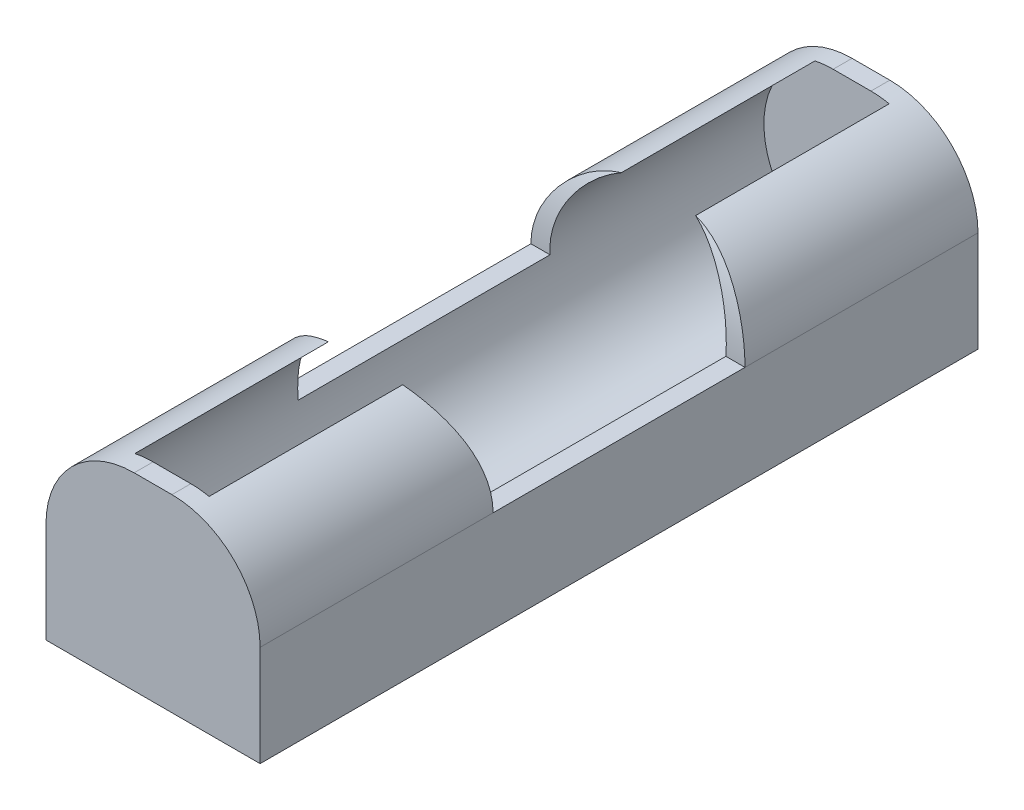
ISO-10303-21;
HEADER;
FILE_DESCRIPTION(('STEP AP214'),'2;1');
FILE_NAME('part.step','',(''),(''),'','','');
FILE_SCHEMA(('AUTOMOTIVE_DESIGN { 1 0 10303 214 1 1 1 1 }'));
ENDSEC;
DATA;
#1=APPLICATION_CONTEXT('core data for automotive mechanical design processes');
#2=APPLICATION_PROTOCOL_DEFINITION('international standard','automotive_design',2000,#1);
#3=PRODUCT_CONTEXT('',#1,'mechanical');
#4=PRODUCT('Part','Part','',(#3));
#5=PRODUCT_RELATED_PRODUCT_CATEGORY('part','',(#4));
#6=PRODUCT_DEFINITION_FORMATION('','',#4);
#7=PRODUCT_DEFINITION_CONTEXT('part definition',#1,'design');
#8=PRODUCT_DEFINITION('design','',#6,#7);
#9=PRODUCT_DEFINITION_SHAPE('','',#8);
#10=(LENGTH_UNIT() NAMED_UNIT(*) SI_UNIT(.MILLI.,.METRE.));
#11=(NAMED_UNIT(*) PLANE_ANGLE_UNIT() SI_UNIT($,.RADIAN.));
#12=(NAMED_UNIT(*) SI_UNIT($,.STERADIAN.) SOLID_ANGLE_UNIT());
#13=UNCERTAINTY_MEASURE_WITH_UNIT(LENGTH_MEASURE(1.E-05),#10,'distance_accuracy_value','');
#14=(GEOMETRIC_REPRESENTATION_CONTEXT(3) GLOBAL_UNCERTAINTY_ASSIGNED_CONTEXT((#13)) GLOBAL_UNIT_ASSIGNED_CONTEXT((#10,
#11,#12)) REPRESENTATION_CONTEXT('',''));
#15=CARTESIAN_POINT('',(0.,0.,0.));
#16=DIRECTION('',(0.,0.,1.));
#17=DIRECTION('',(1.,0.,0.));
#18=AXIS2_PLACEMENT_3D('',#15,#16,#17);
#19=CARTESIAN_POINT('',(7.,8.,0.));
#20=DIRECTION('',(0.,0.,-1.));
#21=DIRECTION('',(-1.,0.,0.));
#22=AXIS2_PLACEMENT_3D('',#19,#20,#21);
#23=CYLINDRICAL_SURFACE('',#22,7.);
#24=CARTESIAN_POINT('',(0.,8.,38.5));
#25=CARTESIAN_POINT('',(-3.02791428196093E-05,8.18650256948795,38.4999677908487));
#26=CARTESIAN_POINT('',(0.00745213054668745,8.37299027210222,38.5034324845597));
#27=CARTESIAN_POINT('',(0.037215864047471,8.74446608335291,38.5171193158626));
#28=CARTESIAN_POINT('',(0.0594918594259879,8.92945470766089,38.5273390203924));
#29=CARTESIAN_POINT('',(0.118493592438619,9.29583497064132,38.5542437349727));
#30=CARTESIAN_POINT('',(0.15515882014047,9.47723837333369,38.5709016664496));
#31=CARTESIAN_POINT('',(0.242536662112689,9.83596427761062,38.6102466221706));
#32=CARTESIAN_POINT('',(0.293250024713716,10.0132865612527,38.6329339675932));
#33=CARTESIAN_POINT('',(0.408146309980953,10.3624580147491,38.6837415865444));
#34=CARTESIAN_POINT('',(0.472312697479756,10.5343136078208,38.7118551873034));
#35=CARTESIAN_POINT('',(0.613590811963072,10.8718043932372,38.7728641703432));
#36=CARTESIAN_POINT('',(0.690707383931659,11.0374372290081,38.8057613416559));
#37=CARTESIAN_POINT('',(0.857288701106083,11.3615938306308,38.8755824875798));
#38=CARTESIAN_POINT('',(0.94675937813588,11.520114132662,38.9125083947905));
#39=CARTESIAN_POINT('',(1.13737812467051,11.8291865805172,38.9895356222528));
#40=CARTESIAN_POINT('',(1.23853045864626,11.9797357869996,39.0296381004452));
#41=CARTESIAN_POINT('',(1.56979552598819,12.4337226634995,39.1577374007052));
#42=CARTESIAN_POINT('',(1.81897872042694,12.7224274844587,39.2497252584945));
#43=CARTESIAN_POINT('',(2.36070650062446,13.2556193063271,39.4350476163557));
#44=CARTESIAN_POINT('',(2.65327851553056,13.5000781175407,39.5283829343146));
#45=CARTESIAN_POINT('',(3.12996211168698,13.8364322657891,39.6650386165154));
#46=CARTESIAN_POINT('',(3.30083644091571,13.9462234576248,39.7113421661203));
#47=CARTESIAN_POINT('',(3.65219577203618,14.1508937626844,39.8001547649785));
#48=CARTESIAN_POINT('',(3.83267670643964,14.2457791209261,39.8426654000864));
#49=CARTESIAN_POINT('',(4.20193543223279,14.4196915654634,39.9224013398545));
#50=CARTESIAN_POINT('',(4.39070178599675,14.4987397239425,39.9596336480315));
#51=CARTESIAN_POINT('',(4.7754678314699,14.6402893059798,40.0275029979085));
#52=CARTESIAN_POINT('',(4.97146548802733,14.7027953452233,40.0581418789009));
#53=CARTESIAN_POINT('',(5.31823632549567,14.7967031406384,40.1047627410677));
#54=CARTESIAN_POINT('',(5.46774085884352,14.8319711777166,40.1224889162482));
#55=CARTESIAN_POINT('',(5.76919289199374,14.8926586863574,40.1532079750568));
#56=CARTESIAN_POINT('',(5.92113981342177,14.9180804548168,40.1662019625477));
#57=CARTESIAN_POINT('',(6.22710310970781,14.9589147458429,40.1871585675717));
#58=CARTESIAN_POINT('',(6.38112367665987,14.9743023323637,40.195108649128));
#59=CARTESIAN_POINT('',(6.69009258185685,14.9948551518446,40.2057548105728));
#60=CARTESIAN_POINT('',(6.84504129783201,15.0000158926547,40.2084485816147));
#61=CARTESIAN_POINT('',(7.,15.,40.2084247660083));
#62=B_SPLINE_CURVE_WITH_KNOTS('',3,(#24,#25,#26,#27,#28,#29,#30,#31,#32,#33,#34,#35,#36,#37,#38,
#39,#40,#41,#42,#43,#44,#45,#46,#47,#48,#49,#50,#51,#52,#53,#54,#55,#56,#57,#58,#59,#60,#61),
.UNSPECIFIED.,.F.,.F.,(4,2,2,2,2,2,2,2,2,2,2,2,2,2,2,2,2,2,4),(0.,0.559302324050476,
1.11840330478182,1.67517790950467,2.23198217878145,2.78810604816921,3.34443844267088,
3.90103889512943,4.45784318464529,5.62945222995478,6.80180511474766,7.42608968451207,
8.05011199949043,8.67329842548846,9.29631078234666,9.75981829178785,10.2232176108998,
10.6877641834084,11.152514763168),.UNSPECIFIED.);
#63=CARTESIAN_POINT('',(0.,8.,38.5));
#64=VERTEX_POINT('',#63);
#65=CARTESIAN_POINT('',(5.55056825520774,14.8482952343768,40.1307610543573));
#66=VERTEX_POINT('',#65);
#67=EDGE_CURVE('E170',#64,#66,#62,.T.);
#68=ORIENTED_EDGE('',*,*,#67,.F.);
#69=DIRECTION('',(0.,0.,1.));
#70=VECTOR('',#69,1.);
#71=CARTESIAN_POINT('',(0.,8.,0.));
#72=LINE('',#71,#70);
#73=CARTESIAN_POINT('',(0.,8.,57.));
#74=VERTEX_POINT('',#73);
#75=EDGE_CURVE('E61',#74,#64,#72,.F.);
#76=ORIENTED_EDGE('',*,*,#75,.F.);
#77=CARTESIAN_POINT('',(7.,8.,57.));
#78=DIRECTION('',(0.,0.,1.));
#79=DIRECTION('',(1.,0.,0.));
#80=AXIS2_PLACEMENT_3D('',#77,#78,#79);
#81=CIRCLE('',#80,7.);
#82=CARTESIAN_POINT('',(7.,15.,57.));
#83=VERTEX_POINT('',#82);
#84=EDGE_CURVE('E225',#83,#74,#81,.T.);
#85=ORIENTED_EDGE('',*,*,#84,.F.);
#86=DIRECTION('',(0.,0.,-1.));
#87=VECTOR('',#86,1.);
#88=CARTESIAN_POINT('',(7.,15.,57.));
#89=LINE('',#88,#87);
#90=CARTESIAN_POINT('',(7.,15.,55.5));
#91=VERTEX_POINT('',#90);
#92=EDGE_CURVE('E220',#83,#91,#89,.T.);
#93=ORIENTED_EDGE('',*,*,#92,.T.);
#94=CARTESIAN_POINT('',(7.,8.,55.5));
#95=DIRECTION('',(0.,0.,1.));
#96=DIRECTION('',(1.,0.,0.));
#97=AXIS2_PLACEMENT_3D('',#94,#95,#96);
#98=CIRCLE('',#97,7.);
#99=CARTESIAN_POINT('',(5.55056825520773,14.8482952343768,55.5));
#100=VERTEX_POINT('',#99);
#101=EDGE_CURVE('E226',#91,#100,#98,.T.);
#102=ORIENTED_EDGE('',*,*,#101,.T.);
#103=DIRECTION('',(0.,0.,1.));
#104=VECTOR('',#103,1.);
#105=CARTESIAN_POINT('',(5.55056825520774,14.8482952343768,1.49999999999999));
#106=LINE('',#105,#104);
#107=EDGE_CURVE('E188',#66,#100,#106,.T.);
#108=ORIENTED_EDGE('',*,*,#107,.F.);
#109=EDGE_LOOP('',(#68,#76,#85,#93,#102,#108));
#110=FACE_BOUND('',#109,.T.);
#111=ADVANCED_FACE('F52',(#110),#23,.T.);
#112=CARTESIAN_POINT('',(10.,8.,0.));
#113=DIRECTION('',(0.,0.,-1.));
#114=DIRECTION('',(1.,0.,0.));
#115=AXIS2_PLACEMENT_3D('',#112,#113,#114);
#116=CYLINDRICAL_SURFACE('',#115,7.);
#117=CARTESIAN_POINT('',(10.,15.,40.2084247660083));
#118=CARTESIAN_POINT('',(10.1854412621884,15.0000324541237,40.2084731712669));
#119=CARTESIAN_POINT('',(10.3708608458787,14.9926325746591,40.2046015608605));
#120=CARTESIAN_POINT('',(10.7401355516913,14.9632152010779,40.1893771176512));
#121=CARTESIAN_POINT('',(10.9239914249849,14.9412051800731,40.1780281095717));
#122=CARTESIAN_POINT('',(11.2878881526745,14.8829616751622,40.1482823627289));
#123=CARTESIAN_POINT('',(11.4679435923076,14.8468006413974,40.1299215343523));
#124=CARTESIAN_POINT('',(11.8239430822851,14.7606782625787,40.086793100389));
#125=CARTESIAN_POINT('',(11.9998867578867,14.7107156649405,40.0620249133046));
#126=CARTESIAN_POINT('',(12.3462072988617,14.5976075424376,40.0069299512024));
#127=CARTESIAN_POINT('',(12.5165941399178,14.5344873380762,39.9766138660473));
#128=CARTESIAN_POINT('',(12.8512187639469,14.3955778071478,39.9113052016491));
#129=CARTESIAN_POINT('',(13.0154541915084,14.3197836871574,39.8763108540401));
#130=CARTESIAN_POINT('',(13.4979236506651,14.0741003564268,39.7657010943418));
#131=CARTESIAN_POINT('',(13.8058007499831,13.8859497641458,39.684479185882));
#132=CARTESIAN_POINT('',(14.4077967018608,13.4514865106073,39.5095269265994));
#133=CARTESIAN_POINT('',(14.699512182645,13.2020631937885,39.415320466167));
#134=CARTESIAN_POINT('',(15.2389090592956,12.6583517610123,39.2288326434394));
#135=CARTESIAN_POINT('',(15.4865785338824,12.3640515388002,39.1365518082716));
#136=CARTESIAN_POINT('',(15.8264703359022,11.8850449762373,39.0040493126311));
#137=CARTESIAN_POINT('',(15.9369219704537,11.7141004037034,38.9597987307507));
#138=CARTESIAN_POINT('',(16.1429037894526,11.3624672430159,38.8756079910039));
#139=CARTESIAN_POINT('',(16.238440267547,11.1817828082593,38.8356660172743));
#140=CARTESIAN_POINT('',(16.4136174197485,10.8120003278364,38.7612736386271));
#141=CARTESIAN_POINT('',(16.4932728074812,10.6229102704265,38.7268181565616));
#142=CARTESIAN_POINT('',(16.6359337743815,10.2375356499936,38.6643815020905));
#143=CARTESIAN_POINT('',(16.6989436346161,10.0412529516649,38.6363986652146));
#144=CARTESIAN_POINT('',(16.7939196227097,9.69308974986792,38.5938729073477));
#145=CARTESIAN_POINT('',(16.8297079870182,9.54243542957573,38.5777195719513));
#146=CARTESIAN_POINT('',(16.8912688752648,9.23871432324135,38.549807639827));
#147=CARTESIAN_POINT('',(16.9170435884872,9.08564807214298,38.538048082509));
#148=CARTESIAN_POINT('',(16.9584130943004,8.77760227803198,38.5191251927904));
#149=CARTESIAN_POINT('',(16.9739907729556,8.62261996103152,38.5119695876589));
#150=CARTESIAN_POINT('',(16.9947934314971,8.31176105991506,38.5023982883734));
#151=CARTESIAN_POINT('',(17.0000146632402,8.1558841725027,38.4999843102839));
#152=CARTESIAN_POINT('',(17.,8.,38.5));
#153=B_SPLINE_CURVE_WITH_KNOTS('',3,(#117,#118,#119,#120,#121,#122,#123,#124,#125,#126,#127,
#128,#129,#130,#131,#132,#133,#134,#135,#136,#137,#138,#139,#140,#141,#142,#143,#144,#145,#146,
#147,#148,#149,#150,#151,#152),.UNSPECIFIED.,.F.,.F.,(4,2,2,2,2,2,2,2,2,2,2,2,2,2,2,2,2,4),(0.,
0.556101628184102,1.11191902841882,1.6649272290295,2.21798563533433,2.76998940207518,
3.32220241728364,4.42700835160839,5.60781482746749,6.78894040993027,7.41310382432549,
8.03700314870989,8.66032172446644,9.28347983235444,9.75016624468459,10.2167505678759,
10.6841159768882,11.1516505011554),.UNSPECIFIED.);
#154=CARTESIAN_POINT('',(11.4494317447923,14.8482952343768,40.1307610543573));
#155=VERTEX_POINT('',#154);
#156=CARTESIAN_POINT('',(17.,8.,38.5));
#157=VERTEX_POINT('',#156);
#158=EDGE_CURVE('E299',#155,#157,#153,.T.);
#159=ORIENTED_EDGE('',*,*,#158,.F.);
#160=DIRECTION('',(0.,0.,1.));
#161=VECTOR('',#160,1.);
#162=CARTESIAN_POINT('',(11.4494317447923,14.8482952343768,1.49999999999999));
#163=LINE('',#162,#161);
#164=CARTESIAN_POINT('',(11.4494317447923,14.8482952343768,55.5));
#165=VERTEX_POINT('',#164);
#166=EDGE_CURVE('E246',#155,#165,#163,.T.);
#167=ORIENTED_EDGE('',*,*,#166,.T.);
#168=CARTESIAN_POINT('',(10.,8.,55.5));
#169=DIRECTION('',(0.,0.,-1.));
#170=DIRECTION('',(-1.,0.,0.));
#171=AXIS2_PLACEMENT_3D('',#168,#169,#170);
#172=CIRCLE('',#171,7.);
#173=CARTESIAN_POINT('',(10.,15.,55.5));
#174=VERTEX_POINT('',#173);
#175=EDGE_CURVE('E263',#174,#165,#172,.T.);
#176=ORIENTED_EDGE('',*,*,#175,.F.);
#177=DIRECTION('',(0.,0.,-1.));
#178=VECTOR('',#177,1.);
#179=CARTESIAN_POINT('',(10.,15.,57.));
#180=LINE('',#179,#178);
#181=CARTESIAN_POINT('',(10.,15.,57.));
#182=VERTEX_POINT('',#181);
#183=EDGE_CURVE('E259',#182,#174,#180,.T.);
#184=ORIENTED_EDGE('',*,*,#183,.F.);
#185=CARTESIAN_POINT('',(10.,8.,57.));
#186=DIRECTION('',(0.,0.,-1.));
#187=DIRECTION('',(-1.,0.,0.));
#188=AXIS2_PLACEMENT_3D('',#185,#186,#187);
#189=CIRCLE('',#188,7.);
#190=CARTESIAN_POINT('',(17.,8.,57.));
#191=VERTEX_POINT('',#190);
#192=EDGE_CURVE('E262',#182,#191,#189,.T.);
#193=ORIENTED_EDGE('',*,*,#192,.T.);
#194=DIRECTION('',(0.,0.,1.));
#195=VECTOR('',#194,1.);
#196=CARTESIAN_POINT('',(17.,8.,0.));
#197=LINE('',#196,#195);
#198=EDGE_CURVE('E239',#191,#157,#197,.F.);
#199=ORIENTED_EDGE('',*,*,#198,.T.);
#200=EDGE_LOOP('',(#159,#167,#176,#184,#193,#199));
#201=FACE_BOUND('',#200,.T.);
#202=ADVANCED_FACE('F398',(#201),#116,.T.);
#203=CARTESIAN_POINT('',(8.50000000000001,8.5,1.49999999999999));
#204=DIRECTION('',(0.,0.,1.));
#205=DIRECTION('',(1.,0.,0.));
#206=AXIS2_PLACEMENT_3D('',#203,#204,#205);
#207=CYLINDRICAL_SURFACE('',#206,7.);
#208=ORIENTED_EDGE('',*,*,#166,.F.);
#209=CARTESIAN_POINT('',(11.4494317447923,14.8482952343768,40.1307610543573));
#210=CARTESIAN_POINT('',(11.6337469610843,14.7626672839438,40.087531979772));
#211=CARTESIAN_POINT('',(11.8137173622224,14.6692888567686,40.0414001547837));
#212=CARTESIAN_POINT('',(12.1639841350562,14.467913532549,39.9448607290055));
#213=CARTESIAN_POINT('',(12.3342844272727,14.3599226207448,39.8944548819848));
#214=CARTESIAN_POINT('',(12.6644623694094,14.1300751905805,39.7908330767821));
#215=CARTESIAN_POINT('',(12.8243346859687,14.0082116632285,39.7376157054489));
#216=CARTESIAN_POINT('',(13.1327658226233,13.7514514578451,39.6298655904827));
#217=CARTESIAN_POINT('',(13.2813246332279,13.6165547688806,39.5753328457463));
#218=CARTESIAN_POINT('',(13.5662045345359,13.3346345735054,39.4664255371684));
#219=CARTESIAN_POINT('',(13.7025374840532,13.1876230897724,39.4120508706463));
#220=CARTESIAN_POINT('',(13.9623357712292,12.8821331610172,39.3047651579916));
#221=CARTESIAN_POINT('',(14.0858009910401,12.7236546109977,39.2518541252668));
#222=CARTESIAN_POINT('',(14.3190540620396,12.3960301869941,39.14878687506));
#223=CARTESIAN_POINT('',(14.4288392513335,12.2268822465475,39.0986311947796));
#224=CARTESIAN_POINT('',(14.6337933398323,11.8789530302579,39.0023413295827));
#225=CARTESIAN_POINT('',(14.7289684037652,11.7001758607127,38.9562054520874));
#226=CARTESIAN_POINT('',(14.9037598522091,11.3342401749208,38.8691401739945));
#227=CARTESIAN_POINT('',(14.9833962835988,11.147092845836,38.828204089112));
#228=CARTESIAN_POINT('',(15.1263672162089,10.7655541996653,38.7525273551394));
#229=CARTESIAN_POINT('',(15.1897097219185,10.5711664933959,38.7177836665837));
#230=CARTESIAN_POINT('',(15.2992831542113,10.1767757781105,38.6554042552277));
#231=CARTESIAN_POINT('',(15.3455357482627,9.97678022772734,38.6277595456422));
#232=CARTESIAN_POINT('',(15.4203708846891,9.57269316500941,38.5802381631633));
#233=CARTESIAN_POINT('',(15.4489623176001,9.36860376700731,38.5603575837042));
#234=CARTESIAN_POINT('',(15.4868665849487,8.97036198422387,38.5297832125745));
#235=CARTESIAN_POINT('',(15.4972308610992,8.77634595195152,38.518610790278));
#236=CARTESIAN_POINT('',(15.5018040937796,8.3880320007164,38.5037038316088));
#237=CARTESIAN_POINT('',(15.4960289396507,8.19373454709188,38.4999619860059));
#238=CARTESIAN_POINT('',(15.4821200218845,8.,38.5));
#239=B_SPLINE_CURVE_WITH_KNOTS('',3,(#209,#210,#211,#212,#213,#214,#215,#216,#217,#218,#219,
#220,#221,#222,#223,#224,#225,#226,#227,#228,#229,#230,#231,#232,#233,#234,#235,#236,#237,#238),
.UNSPECIFIED.,.F.,.F.,(4,2,2,2,2,2,2,2,2,2,2,2,2,2,4),(0.,0.623054256991748,1.2458540805673,
1.86896997551996,2.49208639319073,3.11459171215269,3.73710273176597,4.35973469261608,
4.98210320808351,5.603663398848,6.22491765876538,6.84538153568042,7.46553281924754,
8.0485667675919,8.63102691867463),.UNSPECIFIED.);
#240=CARTESIAN_POINT('',(15.4821200218845,8.,38.5));
#241=VERTEX_POINT('',#240);
#242=EDGE_CURVE('E189',#155,#241,#239,.T.);
#243=ORIENTED_EDGE('',*,*,#242,.T.);
#244=DIRECTION('',(0.,0.,1.));
#245=VECTOR('',#244,1.);
#246=CARTESIAN_POINT('',(15.4821200218845,8.,1.49999999999999));
#247=LINE('',#246,#245);
#248=CARTESIAN_POINT('',(15.4821200218845,8.,18.5));
#249=VERTEX_POINT('',#248);
#250=EDGE_CURVE('E351',#241,#249,#247,.F.);
#251=ORIENTED_EDGE('',*,*,#250,.T.);
#252=CARTESIAN_POINT('',(15.4821200218845,8.,18.5));
#253=CARTESIAN_POINT('',(15.4953924195734,8.18491476415777,18.5000321634661));
#254=CARTESIAN_POINT('',(15.5012589327622,8.37034981336692,18.4966257522864));
#255=CARTESIAN_POINT('',(15.4982998430816,8.74079943802541,18.4830538648903));
#256=CARTESIAN_POINT('',(15.4894787756302,8.92581412561468,18.4728904757615));
#257=CARTESIAN_POINT('',(15.4573409139331,9.293292469376,18.44598010936));
#258=CARTESIAN_POINT('',(15.4340861126515,9.47576364078782,18.4292613997336));
#259=CARTESIAN_POINT('',(15.3734518859583,9.8376525381275,18.3895668917266));
#260=CARTESIAN_POINT('',(15.3360719506767,10.0170701535879,18.3665908674862));
#261=CARTESIAN_POINT('',(15.2476663462478,10.3714477983496,18.3148722381981));
#262=CARTESIAN_POINT('',(15.1966551615051,10.5464123445409,18.2861357621892));
#263=CARTESIAN_POINT('',(15.0814784097516,10.891060908679,18.223459630963));
#264=CARTESIAN_POINT('',(15.0173078592263,11.0607428979732,18.1895180057625));
#265=CARTESIAN_POINT('',(14.8763593894366,11.3939197756699,18.1171009150364));
#266=CARTESIAN_POINT('',(14.7995734256362,11.5574106337501,18.0786225610011));
#267=CARTESIAN_POINT('',(14.6340397614469,11.8772815223083,17.9979197152784));
#268=CARTESIAN_POINT('',(14.5452875275035,12.0336588275606,17.9556938058704));
#269=CARTESIAN_POINT('',(14.2524206527622,12.5064263875502,17.8201894150438));
#270=CARTESIAN_POINT('',(14.0288098595856,12.8095860360227,17.7218528927908));
#271=CARTESIAN_POINT('',(13.5371449109676,13.3752166119242,17.5206679525847));
#272=CARTESIAN_POINT('',(13.2691045244221,13.6377000964372,17.4178209396887));
#273=CARTESIAN_POINT('',(12.7496344684754,14.0705991882188,17.2362426811158));
#274=CARTESIAN_POINT('',(12.5051071625103,14.2489929690072,17.1567103987009));
#275=CARTESIAN_POINT('',(11.9935059255263,14.573477237164,17.0056999589114));
#276=CARTESIAN_POINT('',(11.7264485458378,14.7195911576857,16.9342159775839));
#277=CARTESIAN_POINT('',(11.4494317447923,14.8482952343768,16.8692389456427));
#278=B_SPLINE_CURVE_WITH_KNOTS('',3,(#252,#253,#254,#255,#256,#257,#258,#259,#260,#261,#262,
#263,#264,#265,#266,#267,#268,#269,#270,#271,#272,#273,#274,#275,#276,#277),.UNSPECIFIED.,.F.,
.F.,(4,2,2,2,2,2,2,2,2,2,2,2,4),(0.,0.555976651628492,1.11178165355142,1.66521583312618,
2.21866999172974,2.77153837902979,3.32461652816865,3.87804874024562,4.43169121855432,
5.59442559069243,6.75680029852195,7.69318447146403,8.62888663815892),.UNSPECIFIED.);
#279=CARTESIAN_POINT('',(11.4494317447923,14.8482952343768,16.8692389456427));
#280=VERTEX_POINT('',#279);
#281=EDGE_CURVE('E320',#249,#280,#278,.T.);
#282=ORIENTED_EDGE('',*,*,#281,.T.);
#283=CARTESIAN_POINT('',(11.4494317447923,14.8482952343768,1.49999999999999));
#284=VERTEX_POINT('',#283);
#285=EDGE_CURVE('E243',#284,#280,#163,.T.);
#286=ORIENTED_EDGE('',*,*,#285,.F.);
#287=CARTESIAN_POINT('',(8.50000000000001,8.5,1.49999999999999));
#288=DIRECTION('',(0.,0.,1.));
#289=DIRECTION('',(1.,0.,0.));
#290=AXIS2_PLACEMENT_3D('',#287,#288,#289);
#291=CIRCLE('',#290,7.);
#292=CARTESIAN_POINT('',(5.55056825520774,14.8482952343768,1.49999999999999));
#293=VERTEX_POINT('',#292);
#294=EDGE_CURVE('E214',#293,#284,#291,.T.);
#295=ORIENTED_EDGE('',*,*,#294,.F.);
#296=CARTESIAN_POINT('',(5.55056825520774,14.8482952343768,16.8692389456427));
#297=VERTEX_POINT('',#296);
#298=EDGE_CURVE('E196',#293,#297,#106,.T.);
#299=ORIENTED_EDGE('',*,*,#298,.T.);
#300=CARTESIAN_POINT('',(5.55056825520774,14.8482952343768,16.8692389456427));
#301=CARTESIAN_POINT('',(5.36625303891571,14.7626672839438,16.912468020228));
#302=CARTESIAN_POINT('',(5.18628263777765,14.6692888567686,16.9585998452163));
#303=CARTESIAN_POINT('',(4.8360158649438,14.467913532549,17.0551392709945));
#304=CARTESIAN_POINT('',(4.66571557272726,14.3599226207448,17.1055451180152));
#305=CARTESIAN_POINT('',(4.33553763059062,14.1300751905805,17.2091669232179));
#306=CARTESIAN_POINT('',(4.17566531403133,14.0082116632285,17.2623842945511));
#307=CARTESIAN_POINT('',(3.86723417737669,13.7514514578451,17.3701344095173));
#308=CARTESIAN_POINT('',(3.71867536677211,13.6165547688806,17.4246671542537));
#309=CARTESIAN_POINT('',(3.43379546546414,13.3346345735054,17.5335744628316));
#310=CARTESIAN_POINT('',(3.29746251594686,13.1876230897724,17.5879491293537));
#311=CARTESIAN_POINT('',(3.03766422877085,12.8821331610172,17.6952348420084));
#312=CARTESIAN_POINT('',(2.91419900895994,12.7236546109977,17.7481458747332));
#313=CARTESIAN_POINT('',(2.68094593796037,12.3960301869941,17.85121312494));
#314=CARTESIAN_POINT('',(2.57116074866655,12.2268822465475,17.9013688052204));
#315=CARTESIAN_POINT('',(2.36620666016771,11.8789530302579,17.9976586704173));
#316=CARTESIAN_POINT('',(2.27103159623479,11.7001758607127,18.0437945479126));
#317=CARTESIAN_POINT('',(2.09624014779088,11.3342401749208,18.1308598260055));
#318=CARTESIAN_POINT('',(2.01660371640123,11.147092845836,18.171795910888));
#319=CARTESIAN_POINT('',(1.87363278379108,10.7655541996653,18.2474726448606));
#320=CARTESIAN_POINT('',(1.81029027808149,10.5711664933959,18.2822163334163));
#321=CARTESIAN_POINT('',(1.70071684578871,10.1767757781105,18.3445957447723));
#322=CARTESIAN_POINT('',(1.65446425173732,9.97678022772733,18.3722404543578));
#323=CARTESIAN_POINT('',(1.57962911531094,9.57269316500939,18.4197618368367));
#324=CARTESIAN_POINT('',(1.5510376823999,9.3686037670073,18.4396424162958));
#325=CARTESIAN_POINT('',(1.51313341505133,8.97036198422386,18.4702167874255));
#326=CARTESIAN_POINT('',(1.50276913890083,8.77634595195152,18.481389209722));
#327=CARTESIAN_POINT('',(1.49819590622044,8.38803200071639,18.4962961683912));
#328=CARTESIAN_POINT('',(1.50397106034928,8.19373454709188,18.5000380139941));
#329=CARTESIAN_POINT('',(1.51787997811554,8.,18.5));
#330=B_SPLINE_CURVE_WITH_KNOTS('',3,(#300,#301,#302,#303,#304,#305,#306,#307,#308,#309,#310,
#311,#312,#313,#314,#315,#316,#317,#318,#319,#320,#321,#322,#323,#324,#325,#326,#327,#328,#329),
.UNSPECIFIED.,.F.,.F.,(4,2,2,2,2,2,2,2,2,2,2,2,2,2,4),(0.,0.623054256991752,1.2458540805673,
1.86896997551997,2.49208639319074,3.11459171215269,3.73710273176598,4.35973469261609,
4.98210320808352,5.60366339884801,6.22491765876538,6.84538153568043,7.46553281924755,
8.0485667675919,8.63102691867462),.UNSPECIFIED.);
#331=CARTESIAN_POINT('',(1.51787997811554,8.,18.5));
#332=VERTEX_POINT('',#331);
#333=EDGE_CURVE('E314',#297,#332,#330,.T.);
#334=ORIENTED_EDGE('',*,*,#333,.T.);
#335=DIRECTION('',(0.,0.,1.));
#336=VECTOR('',#335,1.);
#337=CARTESIAN_POINT('',(1.51787997811554,8.,1.49999999999999));
#338=LINE('',#337,#336);
#339=CARTESIAN_POINT('',(1.51787997811554,8.,38.5));
#340=VERTEX_POINT('',#339);
#341=EDGE_CURVE('E354',#332,#340,#338,.T.);
#342=ORIENTED_EDGE('',*,*,#341,.T.);
#343=CARTESIAN_POINT('',(1.51787997811554,8.,38.5));
#344=CARTESIAN_POINT('',(1.50460758042657,8.18491476415777,38.4999678365339));
#345=CARTESIAN_POINT('',(1.49874106723781,8.37034981336692,38.5033742477136));
#346=CARTESIAN_POINT('',(1.50170015691841,8.74079943802541,38.5169461351097));
#347=CARTESIAN_POINT('',(1.51052122436979,8.92581412561468,38.5271095242385));
#348=CARTESIAN_POINT('',(1.54265908606695,9.29329246937599,38.55401989064));
#349=CARTESIAN_POINT('',(1.56591388734855,9.47576364078782,38.5707386002664));
#350=CARTESIAN_POINT('',(1.62654811404173,9.8376525381275,38.6104331082734));
#351=CARTESIAN_POINT('',(1.66392804932333,10.0170701535879,38.6334091325137));
#352=CARTESIAN_POINT('',(1.75233365375224,10.3714477983496,38.6851277618019));
#353=CARTESIAN_POINT('',(1.80334483849494,10.5464123445409,38.7138642378108));
#354=CARTESIAN_POINT('',(1.91852159024838,10.891060908679,38.776540369037));
#355=CARTESIAN_POINT('',(1.98269214077374,11.0607428979732,38.8104819942375));
#356=CARTESIAN_POINT('',(2.12364061056341,11.3939197756699,38.8828990849636));
#357=CARTESIAN_POINT('',(2.20042657436382,11.5574106337501,38.9213774389989));
#358=CARTESIAN_POINT('',(2.36596023855311,11.8772815223083,39.0020802847216));
#359=CARTESIAN_POINT('',(2.45471247249649,12.0336588275606,39.0443061941296));
#360=CARTESIAN_POINT('',(2.74757934723781,12.5064263875502,39.1798105849562));
#361=CARTESIAN_POINT('',(2.97119014041439,12.8095860360227,39.2781471072092));
#362=CARTESIAN_POINT('',(3.46285508903246,13.3752166119242,39.4793320474153));
#363=CARTESIAN_POINT('',(3.73089547557793,13.6377000964372,39.5821790603113));
#364=CARTESIAN_POINT('',(4.25036553152464,14.0705991882188,39.7637573188842));
#365=CARTESIAN_POINT('',(4.49489283748972,14.2489929690072,39.8432896012991));
#366=CARTESIAN_POINT('',(5.00649407447371,14.573477237164,39.9943000410886));
#367=CARTESIAN_POINT('',(5.27355145416222,14.7195911576857,40.0657840224161));
#368=CARTESIAN_POINT('',(5.55056825520774,14.8482952343768,40.1307610543573));
#369=B_SPLINE_CURVE_WITH_KNOTS('',3,(#343,#344,#345,#346,#347,#348,#349,#350,#351,#352,#353,
#354,#355,#356,#357,#358,#359,#360,#361,#362,#363,#364,#365,#366,#367,#368),.UNSPECIFIED.,.F.,
.F.,(4,2,2,2,2,2,2,2,2,2,2,2,4),(0.,0.555976651628492,1.11178165355142,1.66521583312618,
2.21866999172974,2.7715383790298,3.32461652816865,3.87804874024562,4.43169121855432,
5.59442559069243,6.75680029852195,7.69318447146403,8.62888663815892),.UNSPECIFIED.);
#370=EDGE_CURVE('E172',#340,#66,#369,.T.);
#371=ORIENTED_EDGE('',*,*,#370,.T.);
#372=ORIENTED_EDGE('',*,*,#107,.T.);
#373=CARTESIAN_POINT('',(8.50000000000001,8.5,55.5));
#374=DIRECTION('',(0.,0.,1.));
#375=DIRECTION('',(1.,0.,0.));
#376=AXIS2_PLACEMENT_3D('',#373,#374,#375);
#377=CIRCLE('',#376,7.);
#378=EDGE_CURVE('E216',#100,#165,#377,.T.);
#379=ORIENTED_EDGE('',*,*,#378,.T.);
#380=EDGE_LOOP('',(#208,#243,#251,#282,#286,#295,#299,#334,#342,#371,#372,#379));
#381=FACE_BOUND('',#380,.T.);
#382=ADVANCED_FACE('F282',(#381),#207,.F.);
#383=CARTESIAN_POINT('',(0.,15.,0.));
#384=DIRECTION('',(0.,1.,0.));
#385=DIRECTION('',(0.,0.,1.));
#386=AXIS2_PLACEMENT_3D('',#383,#384,#385);
#387=PLANE('',#386);
#388=DIRECTION('',(-1.,0.,0.));
#389=VECTOR('',#388,1.);
#390=CARTESIAN_POINT('',(0.,15.,1.49999999999999));
#391=LINE('',#390,#389);
#392=CARTESIAN_POINT('',(10.,15.,1.49999999999999));
#393=VERTEX_POINT('',#392);
#394=CARTESIAN_POINT('',(7.,15.,1.49999999999999));
#395=VERTEX_POINT('',#394);
#396=EDGE_CURVE('E219',#393,#395,#391,.T.);
#397=ORIENTED_EDGE('',*,*,#396,.F.);
#398=DIRECTION('',(0.,0.,1.));
#399=VECTOR('',#398,1.);
#400=CARTESIAN_POINT('',(10.,15.,0.));
#401=LINE('',#400,#399);
#402=CARTESIAN_POINT('',(10.,15.,0.));
#403=VERTEX_POINT('',#402);
#404=EDGE_CURVE('E250',#403,#393,#401,.T.);
#405=ORIENTED_EDGE('',*,*,#404,.F.);
#406=DIRECTION('',(-1.,0.,0.));
#407=VECTOR('',#406,1.);
#408=CARTESIAN_POINT('',(47.,15.,0.));
#409=LINE('',#408,#407);
#410=CARTESIAN_POINT('',(7.,15.,0.));
#411=VERTEX_POINT('',#410);
#412=EDGE_CURVE('E209',#403,#411,#409,.T.);
#413=ORIENTED_EDGE('',*,*,#412,.T.);
#414=DIRECTION('',(0.,0.,1.));
#415=VECTOR('',#414,1.);
#416=CARTESIAN_POINT('',(7.,15.,0.));
#417=LINE('',#416,#415);
#418=EDGE_CURVE('E203',#411,#395,#417,.T.);
#419=ORIENTED_EDGE('',*,*,#418,.T.);
#420=EDGE_LOOP('',(#397,#405,#413,#419));
#421=FACE_BOUND('',#420,.T.);
#422=ADVANCED_FACE('F371',(#421),#387,.T.);
#423=CARTESIAN_POINT('',(7.,15.,16.7915752339917));
#424=CARTESIAN_POINT('',(6.81455873781161,15.0000324541237,16.7915268287331));
#425=CARTESIAN_POINT('',(6.6291391541213,14.9926325746591,16.7953984391395));
#426=CARTESIAN_POINT('',(6.25986444830871,14.9632152010779,16.8106228823488));
#427=CARTESIAN_POINT('',(6.07600857501512,14.9412051800731,16.8219718904283));
#428=CARTESIAN_POINT('',(5.71211184732548,14.8829616751622,16.8517176372711));
#429=CARTESIAN_POINT('',(5.53205640769237,14.8468006413974,16.8700784656477));
#430=CARTESIAN_POINT('',(5.17605691771488,14.7606782625787,16.913206899611));
#431=CARTESIAN_POINT('',(5.00011324211331,14.7107156649405,16.9379750866954));
#432=CARTESIAN_POINT('',(4.65379270113833,14.5976075424376,16.9930700487976));
#433=CARTESIAN_POINT('',(4.48340586008224,14.5344873380762,17.0233861339527));
#434=CARTESIAN_POINT('',(4.1487812360531,14.3955778071478,17.0886947983509));
#435=CARTESIAN_POINT('',(3.98454580849163,14.3197836871574,17.1236891459599));
#436=CARTESIAN_POINT('',(3.5020763493349,14.0741003564268,17.2342989056582));
#437=CARTESIAN_POINT('',(3.19419925001688,13.8859497641458,17.315520814118));
#438=CARTESIAN_POINT('',(2.59220329813925,13.4514865106073,17.4904730734006));
#439=CARTESIAN_POINT('',(2.30048781735497,13.2020631937885,17.584679533833));
#440=CARTESIAN_POINT('',(1.76109094070444,12.6583517610123,17.7711673565606));
#441=CARTESIAN_POINT('',(1.51342146611759,12.3640515388002,17.8634481917284));
#442=CARTESIAN_POINT('',(1.17352966409782,11.8850449762373,17.9959506873689));
#443=CARTESIAN_POINT('',(1.06307802954634,11.7141004037034,18.0402012692493));
#444=CARTESIAN_POINT('',(0.857096210547415,11.3624672430159,18.1243920089961));
#445=CARTESIAN_POINT('',(0.761559732453061,11.1817828082593,18.1643339827257));
#446=CARTESIAN_POINT('',(0.586382580251509,10.8120003278364,18.2387263613729));
#447=CARTESIAN_POINT('',(0.506727192518793,10.6229102704265,18.2731818434384));
#448=CARTESIAN_POINT('',(0.364066225618553,10.2375356499936,18.3356184979095));
#449=CARTESIAN_POINT('',(0.301056365383931,10.0412529516649,18.3636013347854));
#450=CARTESIAN_POINT('',(0.206080377290321,9.69308974986791,18.4061270926523));
#451=CARTESIAN_POINT('',(0.170292012981767,9.54243542957573,18.4222804280487));
#452=CARTESIAN_POINT('',(0.108731124735194,9.23871432324135,18.450192360173));
#453=CARTESIAN_POINT('',(0.0829564115127768,9.08564807214298,18.461951917491));
#454=CARTESIAN_POINT('',(0.0415869056995668,8.77760227803198,18.4808748072096));
#455=CARTESIAN_POINT('',(0.0260092270444481,8.62261996103152,18.4880304123411));
#456=CARTESIAN_POINT('',(0.00520656850290344,8.31176105991506,18.4976017116266));
#457=CARTESIAN_POINT('',(-1.46632401676146E-05,8.1558841725027,18.5000156897161));
#458=CARTESIAN_POINT('',(0.,8.,18.5));
#459=B_SPLINE_CURVE_WITH_KNOTS('',3,(#423,#424,#425,#426,#427,#428,#429,#430,#431,#432,#433,
#434,#435,#436,#437,#438,#439,#440,#441,#442,#443,#444,#445,#446,#447,#448,#449,#450,#451,#452,
#453,#454,#455,#456,#457,#458),.UNSPECIFIED.,.F.,.F.,(4,2,2,2,2,2,2,2,2,2,2,2,2,2,2,2,2,4),(0.,
0.556101628184101,1.11191902841882,1.66492722902949,2.21798563533433,2.76998940207518,
3.32220241728364,4.42700835160839,5.60781482746749,6.78894040993027,7.41310382432549,
8.03700314870989,8.66032172446644,9.28347983235444,9.75016624468459,10.2167505678759,
10.6841159768882,11.1516505011554),.UNSPECIFIED.);
#460=CARTESIAN_POINT('',(0.,8.,18.5));
#461=VERTEX_POINT('',#460);
#462=EDGE_CURVE('E319',#297,#461,#459,.T.);
#463=ORIENTED_EDGE('',*,*,#462,.F.);
#464=ORIENTED_EDGE('',*,*,#298,.F.);
#465=CARTESIAN_POINT('',(7.,8.,1.49999999999999));
#466=DIRECTION('',(0.,0.,1.));
#467=DIRECTION('',(1.,0.,0.));
#468=AXIS2_PLACEMENT_3D('',#465,#466,#467);
#469=CIRCLE('',#468,7.);
#470=EDGE_CURVE('E200',#395,#293,#469,.T.);
#471=ORIENTED_EDGE('',*,*,#470,.F.);
#472=ORIENTED_EDGE('',*,*,#418,.F.);
#473=CARTESIAN_POINT('',(7.,8.,0.));
#474=DIRECTION('',(0.,0.,1.));
#475=DIRECTION('',(1.,0.,0.));
#476=AXIS2_PLACEMENT_3D('',#473,#474,#475);
#477=CIRCLE('',#476,7.);
#478=CARTESIAN_POINT('',(0.,8.,0.));
#479=VERTEX_POINT('',#478);
#480=EDGE_CURVE('E13',#479,#411,#477,.F.);
#481=ORIENTED_EDGE('',*,*,#480,.F.);
#482=EDGE_CURVE('E195',#461,#479,#72,.F.);
#483=ORIENTED_EDGE('',*,*,#482,.F.);
#484=EDGE_LOOP('',(#463,#464,#471,#472,#481,#483));
#485=FACE_BOUND('',#484,.T.);
#486=ADVANCED_FACE('F54',(#485),#23,.T.);
#487=CARTESIAN_POINT('',(47.,15.,0.));
#488=DIRECTION('',(0.,0.,1.));
#489=DIRECTION('',(1.,0.,0.));
#490=AXIS2_PLACEMENT_3D('',#487,#488,#489);
#491=PLANE('',#490);
#492=ORIENTED_EDGE('',*,*,#412,.F.);
#493=CARTESIAN_POINT('',(10.,8.,0.));
#494=DIRECTION('',(0.,0.,-1.));
#495=DIRECTION('',(-1.,0.,0.));
#496=AXIS2_PLACEMENT_3D('',#493,#494,#495);
#497=CIRCLE('',#496,7.);
#498=CARTESIAN_POINT('',(17.,8.,0.));
#499=VERTEX_POINT('',#498);
#500=EDGE_CURVE('E230',#499,#403,#497,.F.);
#501=ORIENTED_EDGE('',*,*,#500,.F.);
#502=DIRECTION('',(0.,-1.,0.));
#503=VECTOR('',#502,1.);
#504=CARTESIAN_POINT('',(17.,15.,0.));
#505=LINE('',#504,#503);
#506=CARTESIAN_POINT('',(17.,0.,0.));
#507=VERTEX_POINT('',#506);
#508=EDGE_CURVE('E253',#499,#507,#505,.T.);
#509=ORIENTED_EDGE('',*,*,#508,.T.);
#510=DIRECTION('',(-1.,0.,0.));
#511=VECTOR('',#510,1.);
#512=CARTESIAN_POINT('',(47.,0.,0.));
#513=LINE('',#512,#511);
#514=CARTESIAN_POINT('',(0.,0.,0.));
#515=VERTEX_POINT('',#514);
#516=EDGE_CURVE('E212',#507,#515,#513,.T.);
#517=ORIENTED_EDGE('',*,*,#516,.T.);
#518=DIRECTION('',(0.,-1.,0.));
#519=VECTOR('',#518,1.);
#520=CARTESIAN_POINT('',(0.,15.,0.));
#521=LINE('',#520,#519);
#522=EDGE_CURVE('E206',#479,#515,#521,.T.);
#523=ORIENTED_EDGE('',*,*,#522,.F.);
#524=ORIENTED_EDGE('',*,*,#480,.T.);
#525=EDGE_LOOP('',(#492,#501,#509,#517,#523,#524));
#526=FACE_BOUND('',#525,.T.);
#527=ADVANCED_FACE('F368',(#526),#491,.F.);
#528=CARTESIAN_POINT('',(0.,15.,0.));
#529=DIRECTION('',(1.,0.,0.));
#530=DIRECTION('',(0.,0.,-1.));
#531=AXIS2_PLACEMENT_3D('',#528,#529,#530);
#532=PLANE('',#531);
#533=DIRECTION('',(0.,0.,1.));
#534=VECTOR('',#533,1.);
#535=CARTESIAN_POINT('',(0.,0.,0.));
#536=LINE('',#535,#534);
#537=CARTESIAN_POINT('',(0.,0.,57.));
#538=VERTEX_POINT('',#537);
#539=EDGE_CURVE('E210',#515,#538,#536,.T.);
#540=ORIENTED_EDGE('',*,*,#539,.T.);
#541=DIRECTION('',(0.,-1.,0.));
#542=VECTOR('',#541,1.);
#543=CARTESIAN_POINT('',(0.,8.,57.));
#544=LINE('',#543,#542);
#545=EDGE_CURVE('E194',#74,#538,#544,.T.);
#546=ORIENTED_EDGE('',*,*,#545,.F.);
#547=ORIENTED_EDGE('',*,*,#75,.T.);
#548=DIRECTION('',(0.,0.,-1.));
#549=VECTOR('',#548,1.);
#550=CARTESIAN_POINT('',(0.,8.,38.5));
#551=LINE('',#550,#549);
#552=EDGE_CURVE('E177',#64,#461,#551,.T.);
#553=ORIENTED_EDGE('',*,*,#552,.T.);
#554=ORIENTED_EDGE('',*,*,#482,.T.);
#555=ORIENTED_EDGE('',*,*,#522,.T.);
#556=EDGE_LOOP('',(#540,#546,#547,#553,#554,#555));
#557=FACE_BOUND('',#556,.T.);
#558=ADVANCED_FACE('F192',(#557),#532,.F.);
#559=CARTESIAN_POINT('',(0.,0.,0.));
#560=DIRECTION('',(0.,1.,0.));
#561=DIRECTION('',(0.,0.,1.));
#562=AXIS2_PLACEMENT_3D('',#559,#560,#561);
#563=PLANE('',#562);
#564=ORIENTED_EDGE('',*,*,#516,.F.);
#565=DIRECTION('',(0.,0.,1.));
#566=VECTOR('',#565,1.);
#567=CARTESIAN_POINT('',(17.,0.,0.));
#568=LINE('',#567,#566);
#569=CARTESIAN_POINT('',(17.,0.,57.));
#570=VERTEX_POINT('',#569);
#571=EDGE_CURVE('E256',#507,#570,#568,.T.);
#572=ORIENTED_EDGE('',*,*,#571,.T.);
#573=DIRECTION('',(1.,0.,0.));
#574=VECTOR('',#573,1.);
#575=CARTESIAN_POINT('',(0.,0.,57.));
#576=LINE('',#575,#574);
#577=EDGE_CURVE('E234',#538,#570,#576,.T.);
#578=ORIENTED_EDGE('',*,*,#577,.F.);
#579=ORIENTED_EDGE('',*,*,#539,.F.);
#580=EDGE_LOOP('',(#564,#572,#578,#579));
#581=FACE_BOUND('',#580,.T.);
#582=ADVANCED_FACE('F386',(#581),#563,.F.);
#583=CARTESIAN_POINT('',(0.,0.,1.49999999999999));
#584=DIRECTION('',(0.,0.,1.));
#585=DIRECTION('',(1.,0.,0.));
#586=AXIS2_PLACEMENT_3D('',#583,#584,#585);
#587=PLANE('',#586);
#588=ORIENTED_EDGE('',*,*,#294,.T.);
#589=CARTESIAN_POINT('',(10.,8.,1.49999999999999));
#590=DIRECTION('',(0.,0.,-1.));
#591=DIRECTION('',(-1.,0.,0.));
#592=AXIS2_PLACEMENT_3D('',#589,#590,#591);
#593=CIRCLE('',#592,7.);
#594=EDGE_CURVE('E247',#393,#284,#593,.T.);
#595=ORIENTED_EDGE('',*,*,#594,.F.);
#596=ORIENTED_EDGE('',*,*,#396,.T.);
#597=ORIENTED_EDGE('',*,*,#470,.T.);
#598=EDGE_LOOP('',(#588,#595,#596,#597));
#599=FACE_BOUND('',#598,.T.);
#600=ADVANCED_FACE('F376',(#599),#587,.T.);
#601=CARTESIAN_POINT('',(40.,8.,55.5));
#602=DIRECTION('',(0.,0.,1.));
#603=DIRECTION('',(1.,0.,0.));
#604=AXIS2_PLACEMENT_3D('',#601,#602,#603);
#605=PLANE('',#604);
#606=DIRECTION('',(-1.,0.,0.));
#607=VECTOR('',#606,1.);
#608=CARTESIAN_POINT('',(40.,15.,55.5));
#609=LINE('',#608,#607);
#610=EDGE_CURVE('E228',#174,#91,#609,.T.);
#611=ORIENTED_EDGE('',*,*,#610,.F.);
#612=ORIENTED_EDGE('',*,*,#175,.T.);
#613=ORIENTED_EDGE('',*,*,#378,.F.);
#614=ORIENTED_EDGE('',*,*,#101,.F.);
#615=EDGE_LOOP('',(#611,#612,#613,#614));
#616=FACE_BOUND('',#615,.T.);
#617=ADVANCED_FACE('F395',(#616),#605,.F.);
#618=CARTESIAN_POINT('',(40.,15.,57.));
#619=DIRECTION('',(0.,-1.,0.));
#620=DIRECTION('',(0.,0.,-1.));
#621=AXIS2_PLACEMENT_3D('',#618,#619,#620);
#622=PLANE('',#621);
#623=DIRECTION('',(-1.,0.,0.));
#624=VECTOR('',#623,1.);
#625=CARTESIAN_POINT('',(40.,15.,57.));
#626=LINE('',#625,#624);
#627=EDGE_CURVE('E232',#182,#83,#626,.T.);
#628=ORIENTED_EDGE('',*,*,#627,.F.);
#629=ORIENTED_EDGE('',*,*,#183,.T.);
#630=ORIENTED_EDGE('',*,*,#610,.T.);
#631=ORIENTED_EDGE('',*,*,#92,.F.);
#632=EDGE_LOOP('',(#628,#629,#630,#631));
#633=FACE_BOUND('',#632,.T.);
#634=ADVANCED_FACE('F400',(#633),#622,.F.);
#635=CARTESIAN_POINT('',(40.,8.,57.));
#636=DIRECTION('',(0.,0.,1.));
#637=DIRECTION('',(1.,0.,0.));
#638=AXIS2_PLACEMENT_3D('',#635,#636,#637);
#639=PLANE('',#638);
#640=ORIENTED_EDGE('',*,*,#577,.T.);
#641=DIRECTION('',(0.,-1.,0.));
#642=VECTOR('',#641,1.);
#643=CARTESIAN_POINT('',(17.,8.,57.));
#644=LINE('',#643,#642);
#645=EDGE_CURVE('E266',#191,#570,#644,.T.);
#646=ORIENTED_EDGE('',*,*,#645,.F.);
#647=ORIENTED_EDGE('',*,*,#192,.F.);
#648=ORIENTED_EDGE('',*,*,#627,.T.);
#649=ORIENTED_EDGE('',*,*,#84,.T.);
#650=ORIENTED_EDGE('',*,*,#545,.T.);
#651=EDGE_LOOP('',(#640,#646,#647,#648,#649,#650));
#652=FACE_BOUND('',#651,.T.);
#653=ADVANCED_FACE('F388',(#652),#639,.T.);
#654=CARTESIAN_POINT('',(17.,8.,18.5));
#655=CARTESIAN_POINT('',(17.0000302791428,8.18650256948795,18.5000322091513));
#656=CARTESIAN_POINT('',(16.9925478694533,8.37299027210222,18.4965675154403));
#657=CARTESIAN_POINT('',(16.9627841359525,8.74446608335291,18.4828806841374));
#658=CARTESIAN_POINT('',(16.940508140574,8.92945470766089,18.4726609796076));
#659=CARTESIAN_POINT('',(16.8815064075614,9.29583497064132,18.4457562650273));
#660=CARTESIAN_POINT('',(16.8448411798595,9.47723837333369,18.4290983335504));
#661=CARTESIAN_POINT('',(16.7574633378873,9.83596427761062,18.3897533778294));
#662=CARTESIAN_POINT('',(16.7067499752863,10.0132865612527,18.3670660324068));
#663=CARTESIAN_POINT('',(16.5918536900191,10.3624580147491,18.3162584134556));
#664=CARTESIAN_POINT('',(16.5276873025203,10.5343136078208,18.2881448126966));
#665=CARTESIAN_POINT('',(16.3864091880369,10.8718043932372,18.2271358296568));
#666=CARTESIAN_POINT('',(16.3092926160684,11.0374372290081,18.1942386583441));
#667=CARTESIAN_POINT('',(16.1427112988939,11.3615938306308,18.1244175124202));
#668=CARTESIAN_POINT('',(16.0532406218641,11.520114132662,18.0874916052095));
#669=CARTESIAN_POINT('',(15.8626218753295,11.8291865805172,18.0104643777472));
#670=CARTESIAN_POINT('',(15.7614695413538,11.9797357869996,17.9703618995548));
#671=CARTESIAN_POINT('',(15.4302044740118,12.4337226634995,17.8422625992948));
#672=CARTESIAN_POINT('',(15.1810212795731,12.7224274844587,17.7502747415054));
#673=CARTESIAN_POINT('',(14.6392934993756,13.2556193063271,17.5649523836443));
#674=CARTESIAN_POINT('',(14.3467214844695,13.5000781175407,17.4716170656854));
#675=CARTESIAN_POINT('',(13.870037888313,13.8364322657891,17.3349613834846));
#676=CARTESIAN_POINT('',(13.6991635590843,13.9462234576248,17.2886578338797));
#677=CARTESIAN_POINT('',(13.3478042279638,14.1508937626844,17.1998452350215));
#678=CARTESIAN_POINT('',(13.1673232935604,14.2457791209261,17.1573345999136));
#679=CARTESIAN_POINT('',(12.7980645677672,14.4196915654634,17.0775986601455));
#680=CARTESIAN_POINT('',(12.6092982140033,14.4987397239426,17.0403663519685));
#681=CARTESIAN_POINT('',(12.2245321685301,14.6402893059798,16.9724970020915));
#682=CARTESIAN_POINT('',(12.0285345119727,14.7027953452233,16.9418581210991));
#683=CARTESIAN_POINT('',(11.6817636745043,14.7967031406384,16.8952372589323));
#684=CARTESIAN_POINT('',(11.5322591411565,14.8319711777166,16.8775110837518));
#685=CARTESIAN_POINT('',(11.2308071080063,14.8926586863574,16.8467920249432));
#686=CARTESIAN_POINT('',(11.0788601865782,14.9180804548168,16.8337980374523));
#687=CARTESIAN_POINT('',(10.7728968902922,14.9589147458429,16.8128414324283));
#688=CARTESIAN_POINT('',(10.6188763233401,14.9743023323637,16.804891350872));
#689=CARTESIAN_POINT('',(10.3099074181432,14.9948551518446,16.7942451894272));
#690=CARTESIAN_POINT('',(10.154958702168,15.0000158926547,16.7915514183853));
#691=CARTESIAN_POINT('',(10.,15.,16.7915752339917));
#692=B_SPLINE_CURVE_WITH_KNOTS('',3,(#654,#655,#656,#657,#658,#659,#660,#661,#662,#663,#664,
#665,#666,#667,#668,#669,#670,#671,#672,#673,#674,#675,#676,#677,#678,#679,#680,#681,#682,#683,
#684,#685,#686,#687,#688,#689,#690,#691),.UNSPECIFIED.,.F.,.F.,(4,2,2,2,2,2,2,2,2,2,2,2,2,2,2,2,
2,2,4),(0.,0.559302324050474,1.11840330478182,1.67517790950467,2.23198217878145,
2.78810604816921,3.34443844267087,3.90103889512943,4.45784318464529,5.62945222995478,
6.80180511474766,7.42608968451208,8.05011199949043,8.67329842548846,9.29631078234666,
9.75981829178784,10.2232176108998,10.6877641834084,11.152514763168),.UNSPECIFIED.);
#693=CARTESIAN_POINT('',(17.,8.,18.5));
#694=VERTEX_POINT('',#693);
#695=EDGE_CURVE('E338',#694,#280,#692,.T.);
#696=ORIENTED_EDGE('',*,*,#695,.F.);
#697=EDGE_CURVE('E242',#694,#499,#197,.F.);
#698=ORIENTED_EDGE('',*,*,#697,.T.);
#699=ORIENTED_EDGE('',*,*,#500,.T.);
#700=ORIENTED_EDGE('',*,*,#404,.T.);
#701=ORIENTED_EDGE('',*,*,#594,.T.);
#702=ORIENTED_EDGE('',*,*,#285,.T.);
#703=EDGE_LOOP('',(#696,#698,#699,#700,#701,#702));
#704=FACE_BOUND('',#703,.T.);
#705=ADVANCED_FACE('F363',(#704),#116,.T.);
#706=CARTESIAN_POINT('',(17.,15.,0.));
#707=DIRECTION('',(-1.,0.,0.));
#708=DIRECTION('',(0.,0.,-1.));
#709=AXIS2_PLACEMENT_3D('',#706,#707,#708);
#710=PLANE('',#709);
#711=ORIENTED_EDGE('',*,*,#571,.F.);
#712=ORIENTED_EDGE('',*,*,#508,.F.);
#713=ORIENTED_EDGE('',*,*,#697,.F.);
#714=DIRECTION('',(0.,0.,-1.));
#715=VECTOR('',#714,1.);
#716=CARTESIAN_POINT('',(17.,8.,38.5));
#717=LINE('',#716,#715);
#718=EDGE_CURVE('E181',#157,#694,#717,.T.);
#719=ORIENTED_EDGE('',*,*,#718,.F.);
#720=ORIENTED_EDGE('',*,*,#198,.F.);
#721=ORIENTED_EDGE('',*,*,#645,.T.);
#722=EDGE_LOOP('',(#711,#712,#713,#719,#720,#721));
#723=FACE_BOUND('',#722,.T.);
#724=ADVANCED_FACE('F294',(#723),#710,.F.);
#725=CARTESIAN_POINT('',(0.,8.,38.5));
#726=DIRECTION('',(0.,-1.,0.));
#727=DIRECTION('',(0.,0.,-1.));
#728=AXIS2_PLACEMENT_3D('',#725,#726,#727);
#729=PLANE('',#728);
#730=DIRECTION('',(1.,0.,0.));
#731=VECTOR('',#730,1.);
#732=CARTESIAN_POINT('',(0.,8.,38.5));
#733=LINE('',#732,#731);
#734=EDGE_CURVE('E76',#241,#157,#733,.T.);
#735=ORIENTED_EDGE('',*,*,#734,.T.);
#736=ORIENTED_EDGE('',*,*,#718,.T.);
#737=DIRECTION('',(1.,0.,0.));
#738=VECTOR('',#737,1.);
#739=CARTESIAN_POINT('',(0.,8.,18.5));
#740=LINE('',#739,#738);
#741=EDGE_CURVE('E174',#249,#694,#740,.T.);
#742=ORIENTED_EDGE('',*,*,#741,.F.);
#743=ORIENTED_EDGE('',*,*,#250,.F.);
#744=EDGE_LOOP('',(#735,#736,#742,#743));
#745=FACE_BOUND('',#744,.T.);
#746=ADVANCED_FACE('F292',(#745),#729,.F.);
#747=CARTESIAN_POINT('',(0.,8.,3.30509173886056));
#748=DIRECTION('',(1.,0.,0.));
#749=DIRECTION('',(0.,0.,-1.));
#750=AXIS2_PLACEMENT_3D('',#747,#748,#749);
#751=CYLINDRICAL_SURFACE('',#750,15.1949082611394);
#752=ORIENTED_EDGE('',*,*,#741,.T.);
#753=ORIENTED_EDGE('',*,*,#695,.T.);
#754=ORIENTED_EDGE('',*,*,#281,.F.);
#755=EDGE_LOOP('',(#752,#753,#754));
#756=FACE_BOUND('',#755,.T.);
#757=ADVANCED_FACE('F334',(#756),#751,.T.);
#758=CARTESIAN_POINT('',(0.,8.,53.6949082611394));
#759=DIRECTION('',(1.,0.,0.));
#760=DIRECTION('',(0.,0.,-1.));
#761=AXIS2_PLACEMENT_3D('',#758,#759,#760);
#762=CYLINDRICAL_SURFACE('',#761,15.1949082611394);
#763=ORIENTED_EDGE('',*,*,#158,.T.);
#764=ORIENTED_EDGE('',*,*,#734,.F.);
#765=ORIENTED_EDGE('',*,*,#242,.F.);
#766=EDGE_LOOP('',(#763,#764,#765));
#767=FACE_BOUND('',#766,.T.);
#768=ADVANCED_FACE('F291',(#767),#762,.T.);
#769=EDGE_CURVE('E167',#64,#340,#733,.T.);
#770=ORIENTED_EDGE('',*,*,#769,.F.);
#771=ORIENTED_EDGE('',*,*,#67,.T.);
#772=ORIENTED_EDGE('',*,*,#370,.F.);
#773=EDGE_LOOP('',(#770,#771,#772));
#774=FACE_BOUND('',#773,.T.);
#775=ADVANCED_FACE('F168',(#774),#762,.T.);
#776=ORIENTED_EDGE('',*,*,#462,.T.);
#777=EDGE_CURVE('E68',#461,#332,#740,.T.);
#778=ORIENTED_EDGE('',*,*,#777,.T.);
#779=ORIENTED_EDGE('',*,*,#333,.F.);
#780=EDGE_LOOP('',(#776,#778,#779));
#781=FACE_BOUND('',#780,.T.);
#782=ADVANCED_FACE('F290',(#781),#751,.T.);
#783=ORIENTED_EDGE('',*,*,#777,.F.);
#784=ORIENTED_EDGE('',*,*,#552,.F.);
#785=ORIENTED_EDGE('',*,*,#769,.T.);
#786=ORIENTED_EDGE('',*,*,#341,.F.);
#787=EDGE_LOOP('',(#783,#784,#785,#786));
#788=FACE_BOUND('',#787,.T.);
#789=ADVANCED_FACE('F178',(#788),#729,.F.);
#790=CLOSED_SHELL('',(#111,#202,#382,#422,#486,#527,#558,#582,#600,#617,#634,#653,#705,#724,
#746,#757,#768,#775,#782,#789));
#791=MANIFOLD_SOLID_BREP('B2',#790);
#792=ADVANCED_BREP_SHAPE_REPRESENTATION('',(#18,#791),#14);
#793=SHAPE_DEFINITION_REPRESENTATION(#9,#792);
ENDSEC;
END-ISO-10303-21;
